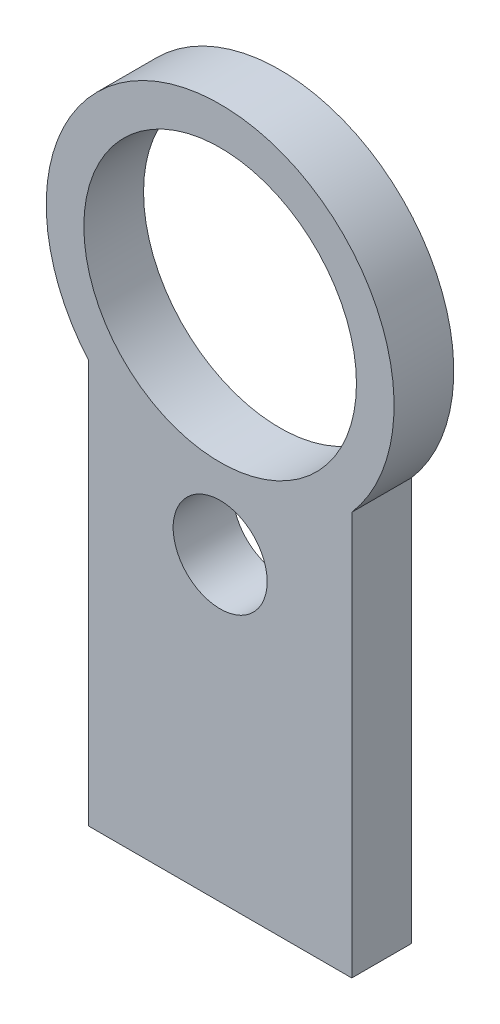
ISO-10303-21;
HEADER;
FILE_DESCRIPTION(('STEP AP214'),'2;1');
FILE_NAME('part.step','',(''),(''),'','','');
FILE_SCHEMA(('AUTOMOTIVE_DESIGN { 1 0 10303 214 1 1 1 1 }'));
ENDSEC;
DATA;
#1=APPLICATION_CONTEXT('core data for automotive mechanical design processes');
#2=APPLICATION_PROTOCOL_DEFINITION('international standard','automotive_design',2000,#1);
#3=PRODUCT_CONTEXT('',#1,'mechanical');
#4=PRODUCT('Part','Part','',(#3));
#5=PRODUCT_RELATED_PRODUCT_CATEGORY('part','',(#4));
#6=PRODUCT_DEFINITION_FORMATION('','',#4);
#7=PRODUCT_DEFINITION_CONTEXT('part definition',#1,'design');
#8=PRODUCT_DEFINITION('design','',#6,#7);
#9=PRODUCT_DEFINITION_SHAPE('','',#8);
#10=(LENGTH_UNIT() NAMED_UNIT(*) SI_UNIT(.MILLI.,.METRE.));
#11=(NAMED_UNIT(*) PLANE_ANGLE_UNIT() SI_UNIT($,.RADIAN.));
#12=(NAMED_UNIT(*) SI_UNIT($,.STERADIAN.) SOLID_ANGLE_UNIT());
#13=UNCERTAINTY_MEASURE_WITH_UNIT(LENGTH_MEASURE(1.E-05),#10,'distance_accuracy_value','');
#14=(GEOMETRIC_REPRESENTATION_CONTEXT(3) GLOBAL_UNCERTAINTY_ASSIGNED_CONTEXT((#13)) GLOBAL_UNIT_ASSIGNED_CONTEXT((#10,
#11,#12)) REPRESENTATION_CONTEXT('',''));
#15=CARTESIAN_POINT('',(0.,0.,0.));
#16=DIRECTION('',(0.,0.,1.));
#17=DIRECTION('',(1.,0.,0.));
#18=AXIS2_PLACEMENT_3D('',#15,#16,#17);
#19=CARTESIAN_POINT('',(0.,0.,6.35));
#20=DIRECTION('',(0.,0.,-1.));
#21=DIRECTION('',(-1.,0.,0.));
#22=AXIS2_PLACEMENT_3D('',#19,#20,#21);
#23=PLANE('',#22);
#24=DIRECTION('',(0.,-1.,0.));
#25=VECTOR('',#24,1.);
#26=CARTESIAN_POINT('',(-14.,-55.,6.35));
#27=LINE('',#26,#25);
#28=CARTESIAN_POINT('',(-14.,-12.0933866224478,6.35));
#29=VERTEX_POINT('',#28);
#30=CARTESIAN_POINT('',(-14.,-55.,6.35));
#31=VERTEX_POINT('',#30);
#32=EDGE_CURVE('E85',#29,#31,#27,.T.);
#33=ORIENTED_EDGE('',*,*,#32,.T.);
#34=DIRECTION('',(1.,0.,0.));
#35=VECTOR('',#34,1.);
#36=CARTESIAN_POINT('',(-14.,-55.,6.35));
#37=LINE('',#36,#35);
#38=CARTESIAN_POINT('',(14.,-55.,6.35));
#39=VERTEX_POINT('',#38);
#40=EDGE_CURVE('E80',#31,#39,#37,.T.);
#41=ORIENTED_EDGE('',*,*,#40,.T.);
#42=DIRECTION('',(0.,1.,0.));
#43=VECTOR('',#42,1.);
#44=CARTESIAN_POINT('',(14.,-55.,6.35));
#45=LINE('',#44,#43);
#46=CARTESIAN_POINT('',(14.,-12.0933866224478,6.35));
#47=VERTEX_POINT('',#46);
#48=EDGE_CURVE('E83',#39,#47,#45,.T.);
#49=ORIENTED_EDGE('',*,*,#48,.T.);
#50=CARTESIAN_POINT('',(0.,0.,6.35));
#51=DIRECTION('',(0.,0.,1.));
#52=DIRECTION('',(-1.,0.,0.));
#53=AXIS2_PLACEMENT_3D('',#50,#51,#52);
#54=CIRCLE('',#53,18.5);
#55=EDGE_CURVE('E50',#47,#29,#54,.T.);
#56=ORIENTED_EDGE('',*,*,#55,.T.);
#57=EDGE_LOOP('',(#33,#41,#49,#56));
#58=FACE_BOUND('',#57,.T.);
#59=CARTESIAN_POINT('',(0.,0.,6.35));
#60=DIRECTION('',(0.,0.,1.));
#61=DIRECTION('',(1.,0.,0.));
#62=AXIS2_PLACEMENT_3D('',#59,#60,#61);
#63=CIRCLE('',#62,14.5);
#64=CARTESIAN_POINT('',(14.5,0.,6.35));
#65=VERTEX_POINT('',#64);
#66=EDGE_CURVE('E100',#65,#65,#63,.T.);
#67=ORIENTED_EDGE('',*,*,#66,.F.);
#68=EDGE_LOOP('',(#67));
#69=FACE_BOUND('',#68,.T.);
#70=CARTESIAN_POINT('',(0.,-23.,6.35));
#71=DIRECTION('',(0.,0.,1.));
#72=DIRECTION('',(1.,0.,0.));
#73=AXIS2_PLACEMENT_3D('',#70,#71,#72);
#74=CIRCLE('',#73,5.);
#75=CARTESIAN_POINT('',(5.,-23.,6.35));
#76=VERTEX_POINT('',#75);
#77=EDGE_CURVE('E115',#76,#76,#74,.T.);
#78=ORIENTED_EDGE('',*,*,#77,.F.);
#79=EDGE_LOOP('',(#78));
#80=FACE_BOUND('',#79,.T.);
#81=ADVANCED_FACE('F33',(#58,#69,#80),#23,.F.);
#82=CARTESIAN_POINT('',(0.,0.,0.));
#83=DIRECTION('',(0.,0.,-1.));
#84=DIRECTION('',(-1.,0.,0.));
#85=AXIS2_PLACEMENT_3D('',#82,#83,#84);
#86=PLANE('',#85);
#87=CARTESIAN_POINT('',(0.,0.,0.));
#88=DIRECTION('',(0.,0.,1.));
#89=DIRECTION('',(1.,0.,0.));
#90=AXIS2_PLACEMENT_3D('',#87,#88,#89);
#91=CIRCLE('',#90,14.5);
#92=CARTESIAN_POINT('',(14.5,0.,0.));
#93=VERTEX_POINT('',#92);
#94=EDGE_CURVE('E112',#93,#93,#91,.T.);
#95=ORIENTED_EDGE('',*,*,#94,.T.);
#96=EDGE_LOOP('',(#95));
#97=FACE_BOUND('',#96,.T.);
#98=DIRECTION('',(0.,-1.,0.));
#99=VECTOR('',#98,1.);
#100=CARTESIAN_POINT('',(-14.,-55.,0.));
#101=LINE('',#100,#99);
#102=CARTESIAN_POINT('',(-14.,-12.0933866224478,0.));
#103=VERTEX_POINT('',#102);
#104=CARTESIAN_POINT('',(-14.,-55.,0.));
#105=VERTEX_POINT('',#104);
#106=EDGE_CURVE('E97',#103,#105,#101,.T.);
#107=ORIENTED_EDGE('',*,*,#106,.F.);
#108=CARTESIAN_POINT('',(0.,0.,0.));
#109=DIRECTION('',(0.,0.,1.));
#110=DIRECTION('',(-1.,0.,0.));
#111=AXIS2_PLACEMENT_3D('',#108,#109,#110);
#112=CIRCLE('',#111,18.5);
#113=CARTESIAN_POINT('',(14.,-12.0933866224478,0.));
#114=VERTEX_POINT('',#113);
#115=EDGE_CURVE('E73',#114,#103,#112,.T.);
#116=ORIENTED_EDGE('',*,*,#115,.F.);
#117=DIRECTION('',(0.,1.,0.));
#118=VECTOR('',#117,1.);
#119=CARTESIAN_POINT('',(14.,-55.,0.));
#120=LINE('',#119,#118);
#121=CARTESIAN_POINT('',(14.,-55.,0.));
#122=VERTEX_POINT('',#121);
#123=EDGE_CURVE('E67',#122,#114,#120,.T.);
#124=ORIENTED_EDGE('',*,*,#123,.F.);
#125=DIRECTION('',(1.,0.,0.));
#126=VECTOR('',#125,1.);
#127=CARTESIAN_POINT('',(-14.,-55.,0.));
#128=LINE('',#127,#126);
#129=EDGE_CURVE('E89',#105,#122,#128,.T.);
#130=ORIENTED_EDGE('',*,*,#129,.F.);
#131=EDGE_LOOP('',(#107,#116,#124,#130));
#132=FACE_BOUND('',#131,.T.);
#133=CARTESIAN_POINT('',(0.,-23.,0.));
#134=DIRECTION('',(0.,0.,1.));
#135=DIRECTION('',(1.,0.,0.));
#136=AXIS2_PLACEMENT_3D('',#133,#134,#135);
#137=CIRCLE('',#136,5.);
#138=CARTESIAN_POINT('',(5.,-23.,0.));
#139=VERTEX_POINT('',#138);
#140=EDGE_CURVE('E118',#139,#139,#137,.T.);
#141=ORIENTED_EDGE('',*,*,#140,.T.);
#142=EDGE_LOOP('',(#141));
#143=FACE_BOUND('',#142,.T.);
#144=ADVANCED_FACE('F108',(#97,#132,#143),#86,.T.);
#145=CARTESIAN_POINT('',(-14.,-55.,6.35));
#146=DIRECTION('',(1.,0.,0.));
#147=DIRECTION('',(0.,0.,-1.));
#148=AXIS2_PLACEMENT_3D('',#145,#146,#147);
#149=PLANE('',#148);
#150=ORIENTED_EDGE('',*,*,#106,.T.);
#151=DIRECTION('',(0.,0.,-1.));
#152=VECTOR('',#151,1.);
#153=CARTESIAN_POINT('',(-14.,-55.,6.35));
#154=LINE('',#153,#152);
#155=EDGE_CURVE('E11',#31,#105,#154,.T.);
#156=ORIENTED_EDGE('',*,*,#155,.F.);
#157=ORIENTED_EDGE('',*,*,#32,.F.);
#158=DIRECTION('',(0.,0.,-1.));
#159=VECTOR('',#158,1.);
#160=CARTESIAN_POINT('',(-14.,-12.0933866224478,6.35));
#161=LINE('',#160,#159);
#162=EDGE_CURVE('E93',#29,#103,#161,.T.);
#163=ORIENTED_EDGE('',*,*,#162,.T.);
#164=EDGE_LOOP('',(#150,#156,#157,#163));
#165=FACE_BOUND('',#164,.T.);
#166=ADVANCED_FACE('F35',(#165),#149,.F.);
#167=CARTESIAN_POINT('',(-14.,-55.,6.35));
#168=DIRECTION('',(0.,1.,0.));
#169=DIRECTION('',(0.,0.,1.));
#170=AXIS2_PLACEMENT_3D('',#167,#168,#169);
#171=PLANE('',#170);
#172=ORIENTED_EDGE('',*,*,#129,.T.);
#173=DIRECTION('',(0.,0.,-1.));
#174=VECTOR('',#173,1.);
#175=CARTESIAN_POINT('',(14.,-55.,6.35));
#176=LINE('',#175,#174);
#177=EDGE_CURVE('E42',#39,#122,#176,.T.);
#178=ORIENTED_EDGE('',*,*,#177,.F.);
#179=ORIENTED_EDGE('',*,*,#40,.F.);
#180=ORIENTED_EDGE('',*,*,#155,.T.);
#181=EDGE_LOOP('',(#172,#178,#179,#180));
#182=FACE_BOUND('',#181,.T.);
#183=ADVANCED_FACE('F88',(#182),#171,.F.);
#184=CARTESIAN_POINT('',(14.,-55.,6.35));
#185=DIRECTION('',(-1.,0.,0.));
#186=DIRECTION('',(0.,0.,1.));
#187=AXIS2_PLACEMENT_3D('',#184,#185,#186);
#188=PLANE('',#187);
#189=ORIENTED_EDGE('',*,*,#123,.T.);
#190=DIRECTION('',(0.,0.,-1.));
#191=VECTOR('',#190,1.);
#192=CARTESIAN_POINT('',(14.,-12.0933866224478,6.35));
#193=LINE('',#192,#191);
#194=EDGE_CURVE('E90',#47,#114,#193,.T.);
#195=ORIENTED_EDGE('',*,*,#194,.F.);
#196=ORIENTED_EDGE('',*,*,#48,.F.);
#197=ORIENTED_EDGE('',*,*,#177,.T.);
#198=EDGE_LOOP('',(#189,#195,#196,#197));
#199=FACE_BOUND('',#198,.T.);
#200=ADVANCED_FACE('F91',(#199),#188,.F.);
#201=CARTESIAN_POINT('',(0.,0.,6.35));
#202=DIRECTION('',(0.,0.,-1.));
#203=DIRECTION('',(-1.,0.,0.));
#204=AXIS2_PLACEMENT_3D('',#201,#202,#203);
#205=CYLINDRICAL_SURFACE('',#204,18.5);
#206=ORIENTED_EDGE('',*,*,#115,.T.);
#207=ORIENTED_EDGE('',*,*,#162,.F.);
#208=ORIENTED_EDGE('',*,*,#55,.F.);
#209=ORIENTED_EDGE('',*,*,#194,.T.);
#210=EDGE_LOOP('',(#206,#207,#208,#209));
#211=FACE_BOUND('',#210,.T.);
#212=ADVANCED_FACE('F105',(#211),#205,.T.);
#213=CARTESIAN_POINT('',(0.,0.,6.35));
#214=DIRECTION('',(0.,0.,-1.));
#215=DIRECTION('',(-1.,0.,0.));
#216=AXIS2_PLACEMENT_3D('',#213,#214,#215);
#217=CYLINDRICAL_SURFACE('',#216,14.5);
#218=ORIENTED_EDGE('',*,*,#66,.T.);
#219=EDGE_LOOP('',(#218));
#220=FACE_BOUND('',#219,.T.);
#221=ORIENTED_EDGE('',*,*,#94,.F.);
#222=EDGE_LOOP('',(#221));
#223=FACE_BOUND('',#222,.T.);
#224=ADVANCED_FACE('F135',(#220,#223),#217,.F.);
#225=CARTESIAN_POINT('',(0.,-23.,6.35));
#226=DIRECTION('',(0.,0.,-1.));
#227=DIRECTION('',(-1.,0.,0.));
#228=AXIS2_PLACEMENT_3D('',#225,#226,#227);
#229=CYLINDRICAL_SURFACE('',#228,5.);
#230=ORIENTED_EDGE('',*,*,#77,.T.);
#231=EDGE_LOOP('',(#230));
#232=FACE_BOUND('',#231,.T.);
#233=ORIENTED_EDGE('',*,*,#140,.F.);
#234=EDGE_LOOP('',(#233));
#235=FACE_BOUND('',#234,.T.);
#236=ADVANCED_FACE('F124',(#232,#235),#229,.F.);
#237=CLOSED_SHELL('',(#81,#144,#166,#183,#200,#212,#224,#236));
#238=MANIFOLD_SOLID_BREP('B2',#237);
#239=ADVANCED_BREP_SHAPE_REPRESENTATION('',(#18,#238),#14);
#240=SHAPE_DEFINITION_REPRESENTATION(#9,#239);
ENDSEC;
END-ISO-10303-21;
